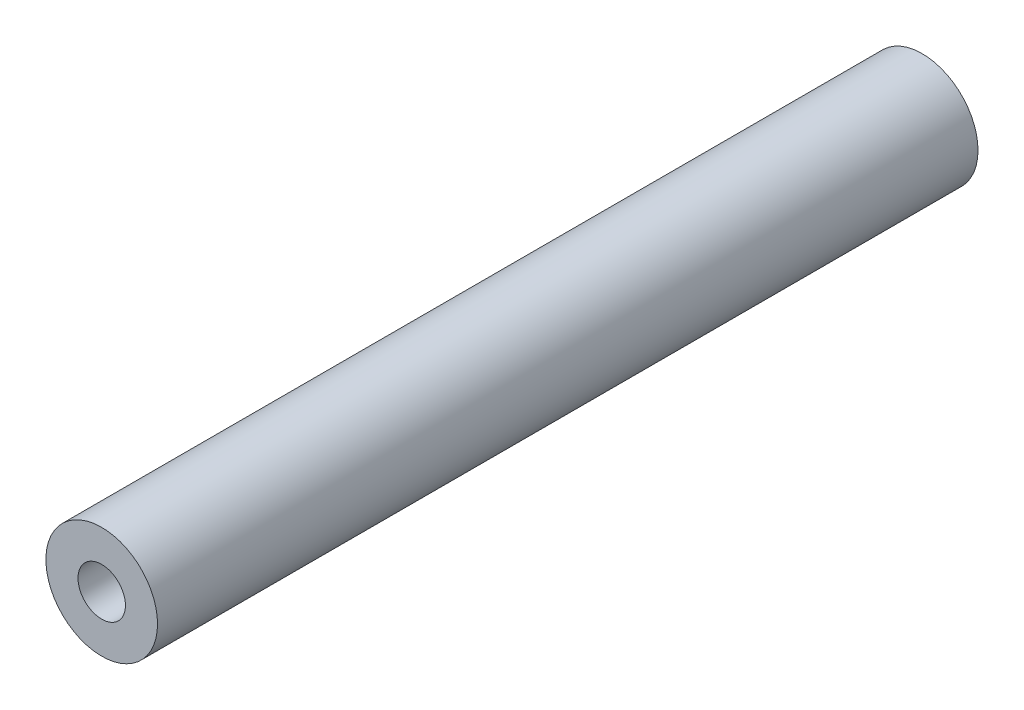
ISO-10303-21;
HEADER;
FILE_DESCRIPTION(('STEP AP214'),'2;1');
FILE_NAME('part.step','',(''),(''),'','','');
FILE_SCHEMA(('AUTOMOTIVE_DESIGN { 1 0 10303 214 1 1 1 1 }'));
ENDSEC;
DATA;
#1=APPLICATION_CONTEXT('core data for automotive mechanical design processes');
#2=APPLICATION_PROTOCOL_DEFINITION('international standard','automotive_design',2000,#1);
#3=PRODUCT_CONTEXT('',#1,'mechanical');
#4=PRODUCT('Part','Part','',(#3));
#5=PRODUCT_RELATED_PRODUCT_CATEGORY('part','',(#4));
#6=PRODUCT_DEFINITION_FORMATION('','',#4);
#7=PRODUCT_DEFINITION_CONTEXT('part definition',#1,'design');
#8=PRODUCT_DEFINITION('design','',#6,#7);
#9=PRODUCT_DEFINITION_SHAPE('','',#8);
#10=(LENGTH_UNIT() NAMED_UNIT(*) SI_UNIT(.MILLI.,.METRE.));
#11=(NAMED_UNIT(*) PLANE_ANGLE_UNIT() SI_UNIT($,.RADIAN.));
#12=(NAMED_UNIT(*) SI_UNIT($,.STERADIAN.) SOLID_ANGLE_UNIT());
#13=UNCERTAINTY_MEASURE_WITH_UNIT(LENGTH_MEASURE(1.E-05),#10,'distance_accuracy_value','');
#14=(GEOMETRIC_REPRESENTATION_CONTEXT(3) GLOBAL_UNCERTAINTY_ASSIGNED_CONTEXT((#13)) GLOBAL_UNIT_ASSIGNED_CONTEXT((#10,
#11,#12)) REPRESENTATION_CONTEXT('',''));
#15=CARTESIAN_POINT('',(0.,0.,0.));
#16=DIRECTION('',(0.,0.,1.));
#17=DIRECTION('',(1.,0.,0.));
#18=AXIS2_PLACEMENT_3D('',#15,#16,#17);
#19=CARTESIAN_POINT('',(0.,0.,73.5));
#20=DIRECTION('',(0.,0.,1.));
#21=DIRECTION('',(1.,0.,0.));
#22=AXIS2_PLACEMENT_3D('',#19,#20,#21);
#23=PLANE('',#22);
#24=CARTESIAN_POINT('',(0.,0.,73.5));
#25=DIRECTION('',(0.,0.,1.));
#26=DIRECTION('',(1.,0.,0.));
#27=AXIS2_PLACEMENT_3D('',#24,#25,#26);
#28=CIRCLE('',#27,10.);
#29=CARTESIAN_POINT('',(10.,0.,73.5));
#30=VERTEX_POINT('',#29);
#31=EDGE_CURVE('E10',#30,#30,#28,.T.);
#32=ORIENTED_EDGE('',*,*,#31,.T.);
#33=EDGE_LOOP('',(#32));
#34=FACE_BOUND('',#33,.T.);
#35=CARTESIAN_POINT('',(0.,0.,73.5));
#36=DIRECTION('',(0.,0.,1.));
#37=DIRECTION('',(1.,0.,0.));
#38=AXIS2_PLACEMENT_3D('',#35,#36,#37);
#39=CIRCLE('',#38,4.25);
#40=CARTESIAN_POINT('',(4.25,0.,73.5));
#41=VERTEX_POINT('',#40);
#42=EDGE_CURVE('E46',#41,#41,#39,.T.);
#43=ORIENTED_EDGE('',*,*,#42,.F.);
#44=EDGE_LOOP('',(#43));
#45=FACE_BOUND('',#44,.T.);
#46=ADVANCED_FACE('F35',(#34,#45),#23,.T.);
#47=CARTESIAN_POINT('',(0.,0.,-73.5));
#48=DIRECTION('',(0.,0.,1.));
#49=DIRECTION('',(1.,0.,0.));
#50=AXIS2_PLACEMENT_3D('',#47,#48,#49);
#51=PLANE('',#50);
#52=CARTESIAN_POINT('',(0.,0.,-73.5));
#53=DIRECTION('',(0.,0.,1.));
#54=DIRECTION('',(1.,0.,0.));
#55=AXIS2_PLACEMENT_3D('',#52,#53,#54);
#56=CIRCLE('',#55,10.);
#57=CARTESIAN_POINT('',(10.,0.,-73.5));
#58=VERTEX_POINT('',#57);
#59=EDGE_CURVE('E39',#58,#58,#56,.T.);
#60=ORIENTED_EDGE('',*,*,#59,.F.);
#61=EDGE_LOOP('',(#60));
#62=FACE_BOUND('',#61,.T.);
#63=CARTESIAN_POINT('',(0.,0.,-73.5));
#64=DIRECTION('',(0.,0.,1.));
#65=DIRECTION('',(1.,0.,0.));
#66=AXIS2_PLACEMENT_3D('',#63,#64,#65);
#67=CIRCLE('',#66,4.25);
#68=CARTESIAN_POINT('',(4.25,0.,-73.5));
#69=VERTEX_POINT('',#68);
#70=EDGE_CURVE('E48',#69,#69,#67,.T.);
#71=ORIENTED_EDGE('',*,*,#70,.T.);
#72=EDGE_LOOP('',(#71));
#73=FACE_BOUND('',#72,.T.);
#74=ADVANCED_FACE('F58',(#62,#73),#51,.F.);
#75=CARTESIAN_POINT('',(0.,0.,73.5));
#76=DIRECTION('',(0.,0.,-1.));
#77=DIRECTION('',(-1.,0.,0.));
#78=AXIS2_PLACEMENT_3D('',#75,#76,#77);
#79=CYLINDRICAL_SURFACE('',#78,10.);
#80=ORIENTED_EDGE('',*,*,#31,.F.);
#81=EDGE_LOOP('',(#80));
#82=FACE_BOUND('',#81,.T.);
#83=ORIENTED_EDGE('',*,*,#59,.T.);
#84=EDGE_LOOP('',(#83));
#85=FACE_BOUND('',#84,.T.);
#86=ADVANCED_FACE('F37',(#82,#85),#79,.T.);
#87=CARTESIAN_POINT('',(0.,0.,73.5));
#88=DIRECTION('',(0.,0.,-1.));
#89=DIRECTION('',(-1.,0.,0.));
#90=AXIS2_PLACEMENT_3D('',#87,#88,#89);
#91=CYLINDRICAL_SURFACE('',#90,4.25);
#92=ORIENTED_EDGE('',*,*,#42,.T.);
#93=EDGE_LOOP('',(#92));
#94=FACE_BOUND('',#93,.T.);
#95=ORIENTED_EDGE('',*,*,#70,.F.);
#96=EDGE_LOOP('',(#95));
#97=FACE_BOUND('',#96,.T.);
#98=ADVANCED_FACE('F54',(#94,#97),#91,.F.);
#99=CLOSED_SHELL('',(#46,#74,#86,#98));
#100=MANIFOLD_SOLID_BREP('B2',#99);
#101=ADVANCED_BREP_SHAPE_REPRESENTATION('',(#18,#100),#14);
#102=SHAPE_DEFINITION_REPRESENTATION(#9,#101);
ENDSEC;
END-ISO-10303-21;
